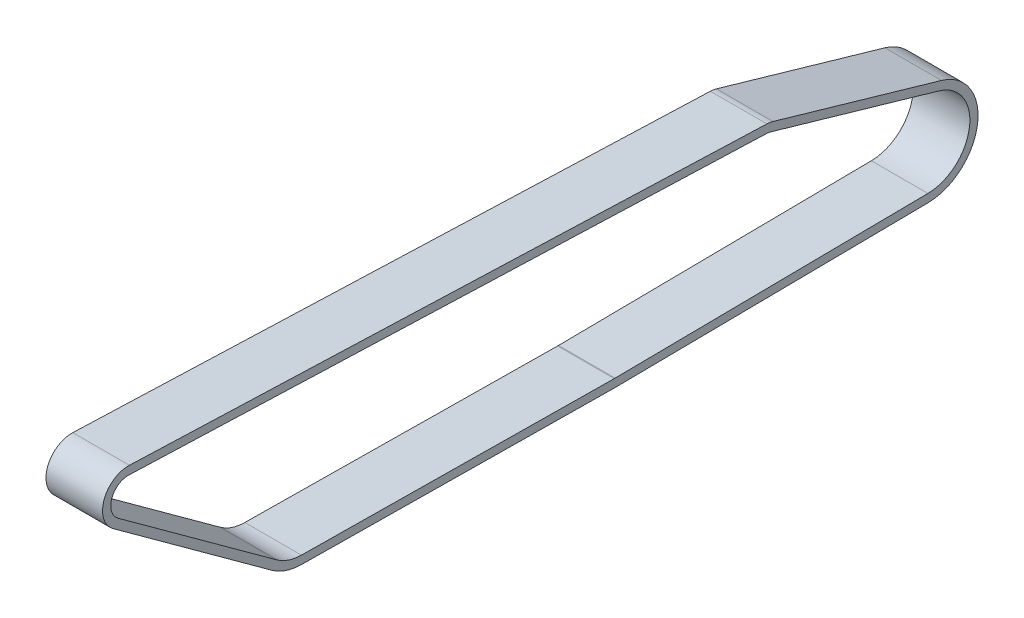
ISO-10303-21;
HEADER;
FILE_DESCRIPTION(('STEP AP214'),'2;1');
FILE_NAME('part.step','',(''),(''),'','','');
FILE_SCHEMA(('AUTOMOTIVE_DESIGN { 1 0 10303 214 1 1 1 1 }'));
ENDSEC;
DATA;
#1=APPLICATION_CONTEXT('core data for automotive mechanical design processes');
#2=APPLICATION_PROTOCOL_DEFINITION('international standard','automotive_design',2000,#1);
#3=PRODUCT_CONTEXT('',#1,'mechanical');
#4=PRODUCT('Part','Part','',(#3));
#5=PRODUCT_RELATED_PRODUCT_CATEGORY('part','',(#4));
#6=PRODUCT_DEFINITION_FORMATION('','',#4);
#7=PRODUCT_DEFINITION_CONTEXT('part definition',#1,'design');
#8=PRODUCT_DEFINITION('design','',#6,#7);
#9=PRODUCT_DEFINITION_SHAPE('','',#8);
#10=(LENGTH_UNIT() NAMED_UNIT(*) SI_UNIT(.MILLI.,.METRE.));
#11=(NAMED_UNIT(*) PLANE_ANGLE_UNIT() SI_UNIT($,.RADIAN.));
#12=(NAMED_UNIT(*) SI_UNIT($,.STERADIAN.) SOLID_ANGLE_UNIT());
#13=UNCERTAINTY_MEASURE_WITH_UNIT(LENGTH_MEASURE(1.E-05),#10,'distance_accuracy_value','');
#14=(GEOMETRIC_REPRESENTATION_CONTEXT(3) GLOBAL_UNCERTAINTY_ASSIGNED_CONTEXT((#13)) GLOBAL_UNIT_ASSIGNED_CONTEXT((#10,
#11,#12)) REPRESENTATION_CONTEXT('',''));
#15=CARTESIAN_POINT('',(0.,0.,0.));
#16=DIRECTION('',(0.,0.,1.));
#17=DIRECTION('',(1.,0.,0.));
#18=AXIS2_PLACEMENT_3D('',#15,#16,#17);
#19=CARTESIAN_POINT('',(50.8,139.781711065105,-19.05));
#20=DIRECTION('',(1.,0.,0.));
#21=DIRECTION('',(0.,0.,-1.));
#22=AXIS2_PLACEMENT_3D('',#19,#20,#21);
#23=PLANE('',#22);
#24=CARTESIAN_POINT('',(50.8,139.781711065105,-19.05));
#25=DIRECTION('',(1.,0.,0.));
#26=DIRECTION('',(0.,0.,-1.));
#27=AXIS2_PLACEMENT_3D('',#24,#25,#26);
#28=CIRCLE('',#27,23.241);
#29=CARTESIAN_POINT('',(50.8,163.007447640308,-19.8921647934332));
#30=VERTEX_POINT('',#29);
#31=CARTESIAN_POINT('',(50.8,120.986489490419,-5.37945769332964));
#32=VERTEX_POINT('',#31);
#33=EDGE_CURVE('E308',#30,#32,#28,.T.);
#34=ORIENTED_EDGE('',*,*,#33,.T.);
#35=DIRECTION('',(0.,-0.588208007687723,-0.80870967577496));
#36=VECTOR('',#35,1.);
#37=CARTESIAN_POINT('',(50.8,120.986489490419,-5.37945769332964));
#38=LINE('',#37,#36);
#39=CARTESIAN_POINT('',(50.8,17.2062058812158,-148.063879551777));
#40=VERTEX_POINT('',#39);
#41=EDGE_CURVE('E311',#32,#40,#38,.T.);
#42=ORIENTED_EDGE('',*,*,#41,.T.);
#43=CARTESIAN_POINT('',(50.8,53.9750000000001,-174.807344829307));
#44=DIRECTION('',(1.,0.,0.));
#45=DIRECTION('',(0.,0.,-1.));
#46=AXIS2_PLACEMENT_3D('',#43,#44,#45);
#47=CIRCLE('',#46,45.466);
#48=CARTESIAN_POINT('',(50.8,8.51190409271173,-174.293470793479));
#49=VERTEX_POINT('',#48);
#50=EDGE_CURVE('E314',#40,#49,#47,.T.);
#51=ORIENTED_EDGE('',*,*,#50,.T.);
#52=DIRECTION('',(0.,-0.0113023805883152,-0.999936126056578));
#53=VECTOR('',#52,1.);
#54=CARTESIAN_POINT('',(50.8,8.51190409271173,-174.293470793479));
#55=LINE('',#54,#53);
#56=CARTESIAN_POINT('',(50.8,5.33690409271174,-455.189798378825));
#57=VERTEX_POINT('',#56);
#58=EDGE_CURVE('E316',#49,#57,#55,.T.);
#59=ORIENTED_EDGE('',*,*,#58,.T.);
#60=CARTESIAN_POINT('',(50.8,50.8000000000001,-455.703672414654));
#61=DIRECTION('',(1.,0.,0.));
#62=DIRECTION('',(0.,0.,-1.));
#63=AXIS2_PLACEMENT_3D('',#60,#61,#62);
#64=CIRCLE('',#63,45.466);
#65=CARTESIAN_POINT('',(50.8,5.33690409271174,-456.217546450482));
#66=VERTEX_POINT('',#65);
#67=EDGE_CURVE('E318',#57,#66,#64,.T.);
#68=ORIENTED_EDGE('',*,*,#67,.T.);
#69=DIRECTION('',(0.,0.0113023805883152,-0.999936126056578));
#70=VECTOR('',#69,1.);
#71=CARTESIAN_POINT('',(50.8,5.33690409271174,-456.217546450482));
#72=LINE('',#71,#70);
#73=CARTESIAN_POINT('',(50.8,8.51190409271173,-737.113874035828));
#74=VERTEX_POINT('',#73);
#75=EDGE_CURVE('E320',#66,#74,#72,.T.);
#76=ORIENTED_EDGE('',*,*,#75,.T.);
#77=CARTESIAN_POINT('',(50.8,53.975,-736.6));
#78=DIRECTION('',(1.,0.,0.));
#79=DIRECTION('',(0.,0.,-1.));
#80=AXIS2_PLACEMENT_3D('',#77,#78,#79);
#81=CIRCLE('',#80,45.4659999999999);
#82=CARTESIAN_POINT('',(50.8,97.654109902954,-749.22111382112));
#83=VERTEX_POINT('',#82);
#84=EDGE_CURVE('E322',#74,#83,#81,.T.);
#85=ORIENTED_EDGE('',*,*,#84,.T.);
#86=DIRECTION('',(0.,0.277594550237976,0.960698321887874));
#87=VECTOR('',#86,1.);
#88=CARTESIAN_POINT('',(50.8,141.372359959145,-597.921135385479));
#89=LINE('',#88,#87);
#90=CARTESIAN_POINT('',(50.8,141.372359959145,-597.921135385479));
#91=VERTEX_POINT('',#90);
#92=EDGE_CURVE('E324',#83,#91,#89,.T.);
#93=ORIENTED_EDGE('',*,*,#92,.T.);
#94=CARTESIAN_POINT('',(50.8,119.654813694548,-591.645832982799));
#95=DIRECTION('',(1.,0.,0.));
#96=DIRECTION('',(0.,0.,-1.));
#97=AXIS2_PLACEMENT_3D('',#94,#95,#96);
#98=CIRCLE('',#97,22.606);
#99=CARTESIAN_POINT('',(50.8,142.245967303215,-592.464987809199));
#100=VERTEX_POINT('',#99);
#101=EDGE_CURVE('E326',#91,#100,#98,.T.);
#102=ORIENTED_EDGE('',*,*,#101,.T.);
#103=DIRECTION('',(0.,0.0362361685570006,0.999343254386754));
#104=VECTOR('',#103,1.);
#105=CARTESIAN_POINT('',(50.8,163.007447640308,-19.8921647934332));
#106=LINE('',#105,#104);
#107=EDGE_CURVE('E328',#100,#30,#106,.T.);
#108=ORIENTED_EDGE('',*,*,#107,.T.);
#109=EDGE_LOOP('',(#34,#42,#51,#59,#68,#76,#85,#93,#102,#108));
#110=FACE_BOUND('',#109,.T.);
#111=DIRECTION('',(0.,-0.588208007687723,-0.80870967577496));
#112=VECTOR('',#111,1.);
#113=CARTESIAN_POINT('',(50.8,126.943444962177,-9.71219787795741));
#114=LINE('',#113,#112);
#115=CARTESIAN_POINT('',(50.8,126.943444962177,-9.71219787795741));
#116=VERTEX_POINT('',#115);
#117=CARTESIAN_POINT('',(50.8,23.1631613529742,-152.396619736405));
#118=VERTEX_POINT('',#117);
#119=EDGE_CURVE('E237',#116,#118,#114,.T.);
#120=ORIENTED_EDGE('',*,*,#119,.F.);
#121=CARTESIAN_POINT('',(50.8,139.781711065105,-19.05));
#122=DIRECTION('',(1.,0.,0.));
#123=DIRECTION('',(0.,0.,-1.));
#124=AXIS2_PLACEMENT_3D('',#121,#122,#123);
#125=CIRCLE('',#124,15.875);
#126=CARTESIAN_POINT('',(50.8,155.646285228495,-19.6252491758424));
#127=VERTEX_POINT('',#126);
#128=EDGE_CURVE('E229',#127,#116,#125,.T.);
#129=ORIENTED_EDGE('',*,*,#128,.F.);
#130=DIRECTION('',(0.,0.0362361685570006,0.999343254386754));
#131=VECTOR('',#130,1.);
#132=CARTESIAN_POINT('',(50.8,155.646285228495,-19.6252491758424));
#133=LINE('',#132,#131);
#134=CARTESIAN_POINT('',(50.8,134.884804891402,-592.198072191608));
#135=VERTEX_POINT('',#134);
#136=EDGE_CURVE('E266',#135,#127,#133,.T.);
#137=ORIENTED_EDGE('',*,*,#136,.F.);
#138=CARTESIAN_POINT('',(50.8,119.654813694548,-591.645832982799));
#139=DIRECTION('',(1.,0.,0.));
#140=DIRECTION('',(0.,0.,-1.));
#141=AXIS2_PLACEMENT_3D('',#138,#139,#140);
#142=CIRCLE('',#141,15.24);
#143=CARTESIAN_POINT('',(50.8,134.295856120119,-595.876373928426));
#144=VERTEX_POINT('',#143);
#145=EDGE_CURVE('E264',#144,#135,#142,.T.);
#146=ORIENTED_EDGE('',*,*,#145,.F.);
#147=DIRECTION('',(0.,0.277594550237976,0.960698321887874));
#148=VECTOR('',#147,1.);
#149=CARTESIAN_POINT('',(50.8,134.295856120119,-595.876373928426));
#150=LINE('',#149,#148);
#151=CARTESIAN_POINT('',(50.8,90.577606063928,-747.176352364067));
#152=VERTEX_POINT('',#151);
#153=EDGE_CURVE('E262',#152,#144,#150,.T.);
#154=ORIENTED_EDGE('',*,*,#153,.F.);
#155=CARTESIAN_POINT('',(50.8,53.975,-736.6));
#156=DIRECTION('',(1.,0.,0.));
#157=DIRECTION('',(0.,0.,-1.));
#158=AXIS2_PLACEMENT_3D('',#155,#156,#157);
#159=CIRCLE('',#158,38.0999999999999);
#160=CARTESIAN_POINT('',(50.8,15.8774335972444,-737.030620700415));
#161=VERTEX_POINT('',#160);
#162=EDGE_CURVE('E260',#161,#152,#159,.T.);
#163=ORIENTED_EDGE('',*,*,#162,.F.);
#164=DIRECTION('',(0.,0.0113023805883152,-0.999936126056578));
#165=VECTOR('',#164,1.);
#166=CARTESIAN_POINT('',(50.8,12.7024335972445,-456.134293115069));
#167=LINE('',#166,#165);
#168=CARTESIAN_POINT('',(50.8,12.7024335972445,-456.134293115069));
#169=VERTEX_POINT('',#168);
#170=EDGE_CURVE('E258',#169,#161,#167,.T.);
#171=ORIENTED_EDGE('',*,*,#170,.F.);
#172=CARTESIAN_POINT('',(50.8,50.8000000000001,-455.703672414654));
#173=DIRECTION('',(1.,0.,0.));
#174=DIRECTION('',(0.,0.,-1.));
#175=AXIS2_PLACEMENT_3D('',#172,#173,#174);
#176=CIRCLE('',#175,38.1);
#177=CARTESIAN_POINT('',(50.8,12.7024335972445,-455.273051714239));
#178=VERTEX_POINT('',#177);
#179=EDGE_CURVE('E256',#178,#169,#176,.T.);
#180=ORIENTED_EDGE('',*,*,#179,.F.);
#181=DIRECTION('',(0.,-0.0113023805883152,-0.999936126056578));
#182=VECTOR('',#181,1.);
#183=CARTESIAN_POINT('',(50.8,15.8774335972445,-174.376724128893));
#184=LINE('',#183,#182);
#185=CARTESIAN_POINT('',(50.8,15.8774335972445,-174.376724128893));
#186=VERTEX_POINT('',#185);
#187=EDGE_CURVE('E252',#186,#178,#184,.T.);
#188=ORIENTED_EDGE('',*,*,#187,.F.);
#189=CARTESIAN_POINT('',(50.8,53.9750000000001,-174.807344829307));
#190=DIRECTION('',(1.,0.,0.));
#191=DIRECTION('',(0.,0.,-1.));
#192=AXIS2_PLACEMENT_3D('',#189,#190,#191);
#193=CIRCLE('',#192,38.1);
#194=EDGE_CURVE('E250',#118,#186,#193,.T.);
#195=ORIENTED_EDGE('',*,*,#194,.F.);
#196=EDGE_LOOP('',(#120,#129,#137,#146,#154,#163,#171,#180,#188,#195));
#197=FACE_BOUND('',#196,.T.);
#198=ADVANCED_FACE('F92',(#110,#197),#23,.T.);
#199=CARTESIAN_POINT('',(0.,139.781711065105,-19.05));
#200=DIRECTION('',(1.,0.,0.));
#201=DIRECTION('',(0.,0.,-1.));
#202=AXIS2_PLACEMENT_3D('',#199,#200,#201);
#203=PLANE('',#202);
#204=CARTESIAN_POINT('',(0.,139.781711065105,-19.05));
#205=DIRECTION('',(1.,0.,0.));
#206=DIRECTION('',(0.,0.,-1.));
#207=AXIS2_PLACEMENT_3D('',#204,#205,#206);
#208=CIRCLE('',#207,23.241);
#209=CARTESIAN_POINT('',(0.,163.007447640308,-19.8921647934332));
#210=VERTEX_POINT('',#209);
#211=CARTESIAN_POINT('',(0.,120.986489490419,-5.37945769332964));
#212=VERTEX_POINT('',#211);
#213=EDGE_CURVE('E245',#210,#212,#208,.T.);
#214=ORIENTED_EDGE('',*,*,#213,.F.);
#215=DIRECTION('',(0.,0.0362361685570006,0.999343254386754));
#216=VECTOR('',#215,1.);
#217=CARTESIAN_POINT('',(0.,163.007447640308,-19.8921647934332));
#218=LINE('',#217,#216);
#219=CARTESIAN_POINT('',(0.,142.245967303215,-592.464987809199));
#220=VERTEX_POINT('',#219);
#221=EDGE_CURVE('E312',#220,#210,#218,.T.);
#222=ORIENTED_EDGE('',*,*,#221,.F.);
#223=CARTESIAN_POINT('',(0.,119.654813694548,-591.645832982799));
#224=DIRECTION('',(1.,0.,0.));
#225=DIRECTION('',(0.,0.,-1.));
#226=AXIS2_PLACEMENT_3D('',#223,#224,#225);
#227=CIRCLE('',#226,22.606);
#228=CARTESIAN_POINT('',(0.,141.372359959145,-597.921135385479));
#229=VERTEX_POINT('',#228);
#230=EDGE_CURVE('E347',#229,#220,#227,.T.);
#231=ORIENTED_EDGE('',*,*,#230,.F.);
#232=DIRECTION('',(0.,0.277594550237976,0.960698321887874));
#233=VECTOR('',#232,1.);
#234=CARTESIAN_POINT('',(0.,141.372359959145,-597.921135385479));
#235=LINE('',#234,#233);
#236=CARTESIAN_POINT('',(0.,97.654109902954,-749.22111382112));
#237=VERTEX_POINT('',#236);
#238=EDGE_CURVE('E345',#237,#229,#235,.T.);
#239=ORIENTED_EDGE('',*,*,#238,.F.);
#240=CARTESIAN_POINT('',(0.,53.975,-736.6));
#241=DIRECTION('',(1.,0.,0.));
#242=DIRECTION('',(0.,0.,-1.));
#243=AXIS2_PLACEMENT_3D('',#240,#241,#242);
#244=CIRCLE('',#243,45.4659999999999);
#245=CARTESIAN_POINT('',(0.,8.51190409271173,-737.113874035828));
#246=VERTEX_POINT('',#245);
#247=EDGE_CURVE('E343',#246,#237,#244,.T.);
#248=ORIENTED_EDGE('',*,*,#247,.F.);
#249=DIRECTION('',(0.,0.0113023805883152,-0.999936126056578));
#250=VECTOR('',#249,1.);
#251=CARTESIAN_POINT('',(0.,5.33690409271174,-456.217546450482));
#252=LINE('',#251,#250);
#253=CARTESIAN_POINT('',(0.,5.33690409271174,-456.217546450482));
#254=VERTEX_POINT('',#253);
#255=EDGE_CURVE('E341',#254,#246,#252,.T.);
#256=ORIENTED_EDGE('',*,*,#255,.F.);
#257=CARTESIAN_POINT('',(0.,50.8000000000001,-455.703672414654));
#258=DIRECTION('',(1.,0.,0.));
#259=DIRECTION('',(0.,0.,-1.));
#260=AXIS2_PLACEMENT_3D('',#257,#258,#259);
#261=CIRCLE('',#260,45.466);
#262=CARTESIAN_POINT('',(0.,5.33690409271174,-455.189798378825));
#263=VERTEX_POINT('',#262);
#264=EDGE_CURVE('E339',#263,#254,#261,.T.);
#265=ORIENTED_EDGE('',*,*,#264,.F.);
#266=DIRECTION('',(0.,-0.0113023805883152,-0.999936126056578));
#267=VECTOR('',#266,1.);
#268=CARTESIAN_POINT('',(0.,8.51190409271173,-174.293470793479));
#269=LINE('',#268,#267);
#270=CARTESIAN_POINT('',(0.,8.51190409271173,-174.293470793479));
#271=VERTEX_POINT('',#270);
#272=EDGE_CURVE('E337',#271,#263,#269,.T.);
#273=ORIENTED_EDGE('',*,*,#272,.F.);
#274=CARTESIAN_POINT('',(0.,53.9750000000001,-174.807344829307));
#275=DIRECTION('',(1.,0.,0.));
#276=DIRECTION('',(0.,0.,-1.));
#277=AXIS2_PLACEMENT_3D('',#274,#275,#276);
#278=CIRCLE('',#277,45.466);
#279=CARTESIAN_POINT('',(0.,17.2062058812158,-148.063879551777));
#280=VERTEX_POINT('',#279);
#281=EDGE_CURVE('E335',#280,#271,#278,.T.);
#282=ORIENTED_EDGE('',*,*,#281,.F.);
#283=DIRECTION('',(0.,-0.588208007687723,-0.80870967577496));
#284=VECTOR('',#283,1.);
#285=CARTESIAN_POINT('',(0.,120.986489490419,-5.37945769332964));
#286=LINE('',#285,#284);
#287=EDGE_CURVE('E333',#212,#280,#286,.T.);
#288=ORIENTED_EDGE('',*,*,#287,.F.);
#289=EDGE_LOOP('',(#214,#222,#231,#239,#248,#256,#265,#273,#282,#288));
#290=FACE_BOUND('',#289,.T.);
#291=CARTESIAN_POINT('',(0.,139.781711065105,-19.05));
#292=DIRECTION('',(1.,0.,0.));
#293=DIRECTION('',(0.,0.,-1.));
#294=AXIS2_PLACEMENT_3D('',#291,#292,#293);
#295=CIRCLE('',#294,15.875);
#296=CARTESIAN_POINT('',(0.,155.646285228495,-19.6252491758424));
#297=VERTEX_POINT('',#296);
#298=CARTESIAN_POINT('',(0.,126.943444962177,-9.71219787795741));
#299=VERTEX_POINT('',#298);
#300=EDGE_CURVE('E115',#297,#299,#295,.T.);
#301=ORIENTED_EDGE('',*,*,#300,.T.);
#302=DIRECTION('',(0.,-0.588208007687723,-0.80870967577496));
#303=VECTOR('',#302,1.);
#304=CARTESIAN_POINT('',(0.,126.943444962177,-9.71219787795741));
#305=LINE('',#304,#303);
#306=CARTESIAN_POINT('',(0.,23.1631613529742,-152.396619736405));
#307=VERTEX_POINT('',#306);
#308=EDGE_CURVE('E244',#299,#307,#305,.T.);
#309=ORIENTED_EDGE('',*,*,#308,.T.);
#310=CARTESIAN_POINT('',(0.,53.9750000000001,-174.807344829307));
#311=DIRECTION('',(1.,0.,0.));
#312=DIRECTION('',(0.,0.,-1.));
#313=AXIS2_PLACEMENT_3D('',#310,#311,#312);
#314=CIRCLE('',#313,38.1);
#315=CARTESIAN_POINT('',(0.,15.8774335972445,-174.376724128893));
#316=VERTEX_POINT('',#315);
#317=EDGE_CURVE('E270',#307,#316,#314,.T.);
#318=ORIENTED_EDGE('',*,*,#317,.T.);
#319=DIRECTION('',(0.,-0.0113023805883152,-0.999936126056578));
#320=VECTOR('',#319,1.);
#321=CARTESIAN_POINT('',(0.,15.8774335972445,-174.376724128893));
#322=LINE('',#321,#320);
#323=CARTESIAN_POINT('',(0.,12.7024335972445,-455.273051714239));
#324=VERTEX_POINT('',#323);
#325=EDGE_CURVE('E273',#316,#324,#322,.T.);
#326=ORIENTED_EDGE('',*,*,#325,.T.);
#327=CARTESIAN_POINT('',(0.,50.8000000000001,-455.703672414654));
#328=DIRECTION('',(1.,0.,0.));
#329=DIRECTION('',(0.,0.,-1.));
#330=AXIS2_PLACEMENT_3D('',#327,#328,#329);
#331=CIRCLE('',#330,38.1);
#332=CARTESIAN_POINT('',(0.,12.7024335972445,-456.134293115069));
#333=VERTEX_POINT('',#332);
#334=EDGE_CURVE('E276',#324,#333,#331,.T.);
#335=ORIENTED_EDGE('',*,*,#334,.T.);
#336=DIRECTION('',(0.,0.0113023805883152,-0.999936126056578));
#337=VECTOR('',#336,1.);
#338=CARTESIAN_POINT('',(0.,12.7024335972445,-456.134293115069));
#339=LINE('',#338,#337);
#340=CARTESIAN_POINT('',(0.,15.8774335972444,-737.030620700415));
#341=VERTEX_POINT('',#340);
#342=EDGE_CURVE('E279',#333,#341,#339,.T.);
#343=ORIENTED_EDGE('',*,*,#342,.T.);
#344=CARTESIAN_POINT('',(0.,53.975,-736.6));
#345=DIRECTION('',(1.,0.,0.));
#346=DIRECTION('',(0.,0.,-1.));
#347=AXIS2_PLACEMENT_3D('',#344,#345,#346);
#348=CIRCLE('',#347,38.0999999999999);
#349=CARTESIAN_POINT('',(0.,90.577606063928,-747.176352364067));
#350=VERTEX_POINT('',#349);
#351=EDGE_CURVE('E282',#341,#350,#348,.T.);
#352=ORIENTED_EDGE('',*,*,#351,.T.);
#353=DIRECTION('',(0.,0.277594550237976,0.960698321887874));
#354=VECTOR('',#353,1.);
#355=CARTESIAN_POINT('',(0.,134.295856120119,-595.876373928426));
#356=LINE('',#355,#354);
#357=CARTESIAN_POINT('',(0.,134.295856120119,-595.876373928426));
#358=VERTEX_POINT('',#357);
#359=EDGE_CURVE('E285',#350,#358,#356,.T.);
#360=ORIENTED_EDGE('',*,*,#359,.T.);
#361=CARTESIAN_POINT('',(0.,119.654813694548,-591.645832982799));
#362=DIRECTION('',(1.,0.,0.));
#363=DIRECTION('',(0.,0.,-1.));
#364=AXIS2_PLACEMENT_3D('',#361,#362,#363);
#365=CIRCLE('',#364,15.24);
#366=CARTESIAN_POINT('',(0.,134.884804891402,-592.198072191608));
#367=VERTEX_POINT('',#366);
#368=EDGE_CURVE('E288',#358,#367,#365,.T.);
#369=ORIENTED_EDGE('',*,*,#368,.T.);
#370=DIRECTION('',(0.,0.0362361685570006,0.999343254386754));
#371=VECTOR('',#370,1.);
#372=CARTESIAN_POINT('',(0.,155.646285228495,-19.6252491758424));
#373=LINE('',#372,#371);
#374=EDGE_CURVE('E238',#367,#297,#373,.T.);
#375=ORIENTED_EDGE('',*,*,#374,.T.);
#376=EDGE_LOOP('',(#301,#309,#318,#326,#335,#343,#352,#360,#369,#375));
#377=FACE_BOUND('',#376,.T.);
#378=ADVANCED_FACE('F383',(#290,#377),#203,.F.);
#379=CARTESIAN_POINT('',(50.8,139.781711065105,-19.05));
#380=DIRECTION('',(-1.,0.,0.));
#381=DIRECTION('',(0.,0.,1.));
#382=AXIS2_PLACEMENT_3D('',#379,#380,#381);
#383=CYLINDRICAL_SURFACE('',#382,23.241);
#384=ORIENTED_EDGE('',*,*,#213,.T.);
#385=DIRECTION('',(-1.,0.,0.));
#386=VECTOR('',#385,1.);
#387=CARTESIAN_POINT('',(50.8,120.986489490419,-5.37945769332964));
#388=LINE('',#387,#386);
#389=EDGE_CURVE('E12',#32,#212,#388,.T.);
#390=ORIENTED_EDGE('',*,*,#389,.F.);
#391=ORIENTED_EDGE('',*,*,#33,.F.);
#392=DIRECTION('',(-1.,0.,0.));
#393=VECTOR('',#392,1.);
#394=CARTESIAN_POINT('',(50.8,163.007447640308,-19.8921647934332));
#395=LINE('',#394,#393);
#396=EDGE_CURVE('E330',#30,#210,#395,.T.);
#397=ORIENTED_EDGE('',*,*,#396,.T.);
#398=EDGE_LOOP('',(#384,#390,#391,#397));
#399=FACE_BOUND('',#398,.T.);
#400=ADVANCED_FACE('F94',(#399),#383,.T.);
#401=CARTESIAN_POINT('',(50.8,120.986489490419,-5.37945769332964));
#402=DIRECTION('',(0.,0.80870967577496,-0.588208007687723));
#403=DIRECTION('',(0.,0.588208007687723,0.80870967577496));
#404=AXIS2_PLACEMENT_3D('',#401,#402,#403);
#405=PLANE('',#404);
#406=ORIENTED_EDGE('',*,*,#287,.T.);
#407=DIRECTION('',(-1.,0.,0.));
#408=VECTOR('',#407,1.);
#409=CARTESIAN_POINT('',(50.8,17.2062058812158,-148.063879551777));
#410=LINE('',#409,#408);
#411=EDGE_CURVE('E100',#40,#280,#410,.T.);
#412=ORIENTED_EDGE('',*,*,#411,.F.);
#413=ORIENTED_EDGE('',*,*,#41,.F.);
#414=ORIENTED_EDGE('',*,*,#389,.T.);
#415=EDGE_LOOP('',(#406,#412,#413,#414));
#416=FACE_BOUND('',#415,.T.);
#417=ADVANCED_FACE('F400',(#416),#405,.F.);
#418=CARTESIAN_POINT('',(50.8,53.9750000000001,-174.807344829307));
#419=DIRECTION('',(-1.,0.,0.));
#420=DIRECTION('',(0.,0.,1.));
#421=AXIS2_PLACEMENT_3D('',#418,#419,#420);
#422=CYLINDRICAL_SURFACE('',#421,45.466);
#423=ORIENTED_EDGE('',*,*,#281,.T.);
#424=DIRECTION('',(-1.,0.,0.));
#425=VECTOR('',#424,1.);
#426=CARTESIAN_POINT('',(50.8,8.51190409271173,-174.293470793479));
#427=LINE('',#426,#425);
#428=EDGE_CURVE('E370',#49,#271,#427,.T.);
#429=ORIENTED_EDGE('',*,*,#428,.F.);
#430=ORIENTED_EDGE('',*,*,#50,.F.);
#431=ORIENTED_EDGE('',*,*,#411,.T.);
#432=EDGE_LOOP('',(#423,#429,#430,#431));
#433=FACE_BOUND('',#432,.T.);
#434=ADVANCED_FACE('F377',(#433),#422,.T.);
#435=CARTESIAN_POINT('',(50.8,8.51190409271173,-174.293470793479));
#436=DIRECTION('',(0.,0.999936126056578,-0.0113023805883152));
#437=DIRECTION('',(0.,0.0113023805883152,0.999936126056578));
#438=AXIS2_PLACEMENT_3D('',#435,#436,#437);
#439=PLANE('',#438);
#440=ORIENTED_EDGE('',*,*,#272,.T.);
#441=DIRECTION('',(-1.,0.,0.));
#442=VECTOR('',#441,1.);
#443=CARTESIAN_POINT('',(50.8,5.33690409271174,-455.189798378825));
#444=LINE('',#443,#442);
#445=EDGE_CURVE('E367',#57,#263,#444,.T.);
#446=ORIENTED_EDGE('',*,*,#445,.F.);
#447=ORIENTED_EDGE('',*,*,#58,.F.);
#448=ORIENTED_EDGE('',*,*,#428,.T.);
#449=EDGE_LOOP('',(#440,#446,#447,#448));
#450=FACE_BOUND('',#449,.T.);
#451=ADVANCED_FACE('F389',(#450),#439,.F.);
#452=CARTESIAN_POINT('',(50.8,50.8000000000001,-455.703672414654));
#453=DIRECTION('',(-1.,0.,0.));
#454=DIRECTION('',(0.,0.,1.));
#455=AXIS2_PLACEMENT_3D('',#452,#453,#454);
#456=CYLINDRICAL_SURFACE('',#455,45.466);
#457=ORIENTED_EDGE('',*,*,#264,.T.);
#458=DIRECTION('',(-1.,0.,0.));
#459=VECTOR('',#458,1.);
#460=CARTESIAN_POINT('',(50.8,5.33690409271174,-456.217546450482));
#461=LINE('',#460,#459);
#462=EDGE_CURVE('E364',#66,#254,#461,.T.);
#463=ORIENTED_EDGE('',*,*,#462,.F.);
#464=ORIENTED_EDGE('',*,*,#67,.F.);
#465=ORIENTED_EDGE('',*,*,#445,.T.);
#466=EDGE_LOOP('',(#457,#463,#464,#465));
#467=FACE_BOUND('',#466,.T.);
#468=ADVANCED_FACE('F393',(#467),#456,.T.);
#469=CARTESIAN_POINT('',(50.8,5.33690409271174,-456.217546450482));
#470=DIRECTION('',(0.,0.999936126056578,0.0113023805883152));
#471=DIRECTION('',(0.,-0.0113023805883152,0.999936126056578));
#472=AXIS2_PLACEMENT_3D('',#469,#470,#471);
#473=PLANE('',#472);
#474=ORIENTED_EDGE('',*,*,#255,.T.);
#475=DIRECTION('',(-1.,0.,0.));
#476=VECTOR('',#475,1.);
#477=CARTESIAN_POINT('',(50.8,8.51190409271173,-737.113874035828));
#478=LINE('',#477,#476);
#479=EDGE_CURVE('E361',#74,#246,#478,.T.);
#480=ORIENTED_EDGE('',*,*,#479,.F.);
#481=ORIENTED_EDGE('',*,*,#75,.F.);
#482=ORIENTED_EDGE('',*,*,#462,.T.);
#483=EDGE_LOOP('',(#474,#480,#481,#482));
#484=FACE_BOUND('',#483,.T.);
#485=ADVANCED_FACE('F423',(#484),#473,.F.);
#486=CARTESIAN_POINT('',(50.8,53.975,-736.6));
#487=DIRECTION('',(-1.,0.,0.));
#488=DIRECTION('',(0.,0.,1.));
#489=AXIS2_PLACEMENT_3D('',#486,#487,#488);
#490=CYLINDRICAL_SURFACE('',#489,45.4659999999999);
#491=ORIENTED_EDGE('',*,*,#247,.T.);
#492=DIRECTION('',(-1.,0.,0.));
#493=VECTOR('',#492,1.);
#494=CARTESIAN_POINT('',(50.8,97.654109902954,-749.22111382112));
#495=LINE('',#494,#493);
#496=EDGE_CURVE('E358',#83,#237,#495,.T.);
#497=ORIENTED_EDGE('',*,*,#496,.F.);
#498=ORIENTED_EDGE('',*,*,#84,.F.);
#499=ORIENTED_EDGE('',*,*,#479,.T.);
#500=EDGE_LOOP('',(#491,#497,#498,#499));
#501=FACE_BOUND('',#500,.T.);
#502=ADVANCED_FACE('F420',(#501),#490,.T.);
#503=CARTESIAN_POINT('',(50.8,141.372359959145,-597.921135385479));
#504=DIRECTION('',(0.,-0.960698321887873,0.277594550237975));
#505=DIRECTION('',(0.,-0.277594550237976,-0.960698321887874));
#506=AXIS2_PLACEMENT_3D('',#503,#504,#505);
#507=PLANE('',#506);
#508=ORIENTED_EDGE('',*,*,#238,.T.);
#509=DIRECTION('',(-1.,0.,0.));
#510=VECTOR('',#509,1.);
#511=CARTESIAN_POINT('',(50.8,141.372359959145,-597.921135385479));
#512=LINE('',#511,#510);
#513=EDGE_CURVE('E355',#91,#229,#512,.T.);
#514=ORIENTED_EDGE('',*,*,#513,.F.);
#515=ORIENTED_EDGE('',*,*,#92,.F.);
#516=ORIENTED_EDGE('',*,*,#496,.T.);
#517=EDGE_LOOP('',(#508,#514,#515,#516));
#518=FACE_BOUND('',#517,.T.);
#519=ADVANCED_FACE('F416',(#518),#507,.F.);
#520=CARTESIAN_POINT('',(50.8,119.654813694548,-591.645832982799));
#521=DIRECTION('',(-1.,0.,0.));
#522=DIRECTION('',(0.,0.,1.));
#523=AXIS2_PLACEMENT_3D('',#520,#521,#522);
#524=CYLINDRICAL_SURFACE('',#523,22.606);
#525=ORIENTED_EDGE('',*,*,#230,.T.);
#526=DIRECTION('',(-1.,0.,0.));
#527=VECTOR('',#526,1.);
#528=CARTESIAN_POINT('',(50.8,142.245967303215,-592.464987809199));
#529=LINE('',#528,#527);
#530=EDGE_CURVE('E352',#100,#220,#529,.T.);
#531=ORIENTED_EDGE('',*,*,#530,.F.);
#532=ORIENTED_EDGE('',*,*,#101,.F.);
#533=ORIENTED_EDGE('',*,*,#513,.T.);
#534=EDGE_LOOP('',(#525,#531,#532,#533));
#535=FACE_BOUND('',#534,.T.);
#536=ADVANCED_FACE('F412',(#535),#524,.T.);
#537=CARTESIAN_POINT('',(50.8,163.007447640308,-19.8921647934332));
#538=DIRECTION('',(0.,-0.999343254386754,0.0362361685570006));
#539=DIRECTION('',(0.,-0.0362361685570006,-0.999343254386754));
#540=AXIS2_PLACEMENT_3D('',#537,#538,#539);
#541=PLANE('',#540);
#542=ORIENTED_EDGE('',*,*,#221,.T.);
#543=ORIENTED_EDGE('',*,*,#396,.F.);
#544=ORIENTED_EDGE('',*,*,#107,.F.);
#545=ORIENTED_EDGE('',*,*,#530,.T.);
#546=EDGE_LOOP('',(#542,#543,#544,#545));
#547=FACE_BOUND('',#546,.T.);
#548=ADVANCED_FACE('F407',(#547),#541,.F.);
#549=CARTESIAN_POINT('',(50.8,139.781711065105,-19.05));
#550=DIRECTION('',(-1.,0.,0.));
#551=DIRECTION('',(0.,0.,1.));
#552=AXIS2_PLACEMENT_3D('',#549,#550,#551);
#553=CYLINDRICAL_SURFACE('',#552,15.875);
#554=ORIENTED_EDGE('',*,*,#300,.F.);
#555=DIRECTION('',(-1.,0.,0.));
#556=VECTOR('',#555,1.);
#557=CARTESIAN_POINT('',(50.8,155.646285228495,-19.6252491758424));
#558=LINE('',#557,#556);
#559=EDGE_CURVE('E233',#127,#297,#558,.T.);
#560=ORIENTED_EDGE('',*,*,#559,.F.);
#561=ORIENTED_EDGE('',*,*,#128,.T.);
#562=DIRECTION('',(-1.,0.,0.));
#563=VECTOR('',#562,1.);
#564=CARTESIAN_POINT('',(50.8,126.943444962177,-9.71219787795741));
#565=LINE('',#564,#563);
#566=EDGE_CURVE('E232',#116,#299,#565,.T.);
#567=ORIENTED_EDGE('',*,*,#566,.T.);
#568=EDGE_LOOP('',(#554,#560,#561,#567));
#569=FACE_BOUND('',#568,.T.);
#570=ADVANCED_FACE('F231',(#569),#553,.F.);
#571=CARTESIAN_POINT('',(50.8,126.943444962177,-9.71219787795741));
#572=DIRECTION('',(0.,0.80870967577496,-0.588208007687723));
#573=DIRECTION('',(0.,0.588208007687723,0.80870967577496));
#574=AXIS2_PLACEMENT_3D('',#571,#572,#573);
#575=PLANE('',#574);
#576=ORIENTED_EDGE('',*,*,#308,.F.);
#577=ORIENTED_EDGE('',*,*,#566,.F.);
#578=ORIENTED_EDGE('',*,*,#119,.T.);
#579=DIRECTION('',(-1.,0.,0.));
#580=VECTOR('',#579,1.);
#581=CARTESIAN_POINT('',(50.8,23.1631613529742,-152.396619736405));
#582=LINE('',#581,#580);
#583=EDGE_CURVE('E246',#118,#307,#582,.T.);
#584=ORIENTED_EDGE('',*,*,#583,.T.);
#585=EDGE_LOOP('',(#576,#577,#578,#584));
#586=FACE_BOUND('',#585,.T.);
#587=ADVANCED_FACE('F241',(#586),#575,.T.);
#588=CARTESIAN_POINT('',(50.8,53.9750000000001,-174.807344829307));
#589=DIRECTION('',(-1.,0.,0.));
#590=DIRECTION('',(0.,0.,1.));
#591=AXIS2_PLACEMENT_3D('',#588,#589,#590);
#592=CYLINDRICAL_SURFACE('',#591,38.1);
#593=ORIENTED_EDGE('',*,*,#317,.F.);
#594=ORIENTED_EDGE('',*,*,#583,.F.);
#595=ORIENTED_EDGE('',*,*,#194,.T.);
#596=DIRECTION('',(-1.,0.,0.));
#597=VECTOR('',#596,1.);
#598=CARTESIAN_POINT('',(50.8,15.8774335972445,-174.376724128893));
#599=LINE('',#598,#597);
#600=EDGE_CURVE('E305',#186,#316,#599,.T.);
#601=ORIENTED_EDGE('',*,*,#600,.T.);
#602=EDGE_LOOP('',(#593,#594,#595,#601));
#603=FACE_BOUND('',#602,.T.);
#604=ADVANCED_FACE('F469',(#603),#592,.F.);
#605=CARTESIAN_POINT('',(50.8,15.8774335972445,-174.376724128893));
#606=DIRECTION('',(0.,0.999936126056578,-0.0113023805883152));
#607=DIRECTION('',(0.,0.0113023805883152,0.999936126056578));
#608=AXIS2_PLACEMENT_3D('',#605,#606,#607);
#609=PLANE('',#608);
#610=ORIENTED_EDGE('',*,*,#325,.F.);
#611=ORIENTED_EDGE('',*,*,#600,.F.);
#612=ORIENTED_EDGE('',*,*,#187,.T.);
#613=DIRECTION('',(-1.,0.,0.));
#614=VECTOR('',#613,1.);
#615=CARTESIAN_POINT('',(50.8,12.7024335972445,-455.273051714239));
#616=LINE('',#615,#614);
#617=EDGE_CURVE('E303',#178,#324,#616,.T.);
#618=ORIENTED_EDGE('',*,*,#617,.T.);
#619=EDGE_LOOP('',(#610,#611,#612,#618));
#620=FACE_BOUND('',#619,.T.);
#621=ADVANCED_FACE('F475',(#620),#609,.T.);
#622=CARTESIAN_POINT('',(50.8,50.8000000000001,-455.703672414654));
#623=DIRECTION('',(-1.,0.,0.));
#624=DIRECTION('',(0.,0.,1.));
#625=AXIS2_PLACEMENT_3D('',#622,#623,#624);
#626=CYLINDRICAL_SURFACE('',#625,38.1);
#627=ORIENTED_EDGE('',*,*,#334,.F.);
#628=ORIENTED_EDGE('',*,*,#617,.F.);
#629=ORIENTED_EDGE('',*,*,#179,.T.);
#630=DIRECTION('',(-1.,0.,0.));
#631=VECTOR('',#630,1.);
#632=CARTESIAN_POINT('',(50.8,12.7024335972445,-456.134293115069));
#633=LINE('',#632,#631);
#634=EDGE_CURVE('E301',#169,#333,#633,.T.);
#635=ORIENTED_EDGE('',*,*,#634,.T.);
#636=EDGE_LOOP('',(#627,#628,#629,#635));
#637=FACE_BOUND('',#636,.T.);
#638=ADVANCED_FACE('F483',(#637),#626,.F.);
#639=CARTESIAN_POINT('',(50.8,12.7024335972445,-456.134293115069));
#640=DIRECTION('',(0.,0.999936126056578,0.0113023805883152));
#641=DIRECTION('',(0.,-0.0113023805883152,0.999936126056578));
#642=AXIS2_PLACEMENT_3D('',#639,#640,#641);
#643=PLANE('',#642);
#644=ORIENTED_EDGE('',*,*,#342,.F.);
#645=ORIENTED_EDGE('',*,*,#634,.F.);
#646=ORIENTED_EDGE('',*,*,#170,.T.);
#647=DIRECTION('',(-1.,0.,0.));
#648=VECTOR('',#647,1.);
#649=CARTESIAN_POINT('',(50.8,15.8774335972444,-737.030620700415));
#650=LINE('',#649,#648);
#651=EDGE_CURVE('E299',#161,#341,#650,.T.);
#652=ORIENTED_EDGE('',*,*,#651,.T.);
#653=EDGE_LOOP('',(#644,#645,#646,#652));
#654=FACE_BOUND('',#653,.T.);
#655=ADVANCED_FACE('F491',(#654),#643,.T.);
#656=CARTESIAN_POINT('',(50.8,53.975,-736.6));
#657=DIRECTION('',(-1.,0.,0.));
#658=DIRECTION('',(0.,0.,1.));
#659=AXIS2_PLACEMENT_3D('',#656,#657,#658);
#660=CYLINDRICAL_SURFACE('',#659,38.0999999999999);
#661=ORIENTED_EDGE('',*,*,#351,.F.);
#662=ORIENTED_EDGE('',*,*,#651,.F.);
#663=ORIENTED_EDGE('',*,*,#162,.T.);
#664=DIRECTION('',(-1.,0.,0.));
#665=VECTOR('',#664,1.);
#666=CARTESIAN_POINT('',(50.8,90.577606063928,-747.176352364067));
#667=LINE('',#666,#665);
#668=EDGE_CURVE('E297',#152,#350,#667,.T.);
#669=ORIENTED_EDGE('',*,*,#668,.T.);
#670=EDGE_LOOP('',(#661,#662,#663,#669));
#671=FACE_BOUND('',#670,.T.);
#672=ADVANCED_FACE('F499',(#671),#660,.F.);
#673=CARTESIAN_POINT('',(50.8,134.295856120119,-595.876373928426));
#674=DIRECTION('',(0.,-0.960698321887873,0.277594550237975));
#675=DIRECTION('',(0.,-0.277594550237976,-0.960698321887874));
#676=AXIS2_PLACEMENT_3D('',#673,#674,#675);
#677=PLANE('',#676);
#678=ORIENTED_EDGE('',*,*,#359,.F.);
#679=ORIENTED_EDGE('',*,*,#668,.F.);
#680=ORIENTED_EDGE('',*,*,#153,.T.);
#681=DIRECTION('',(-1.,0.,0.));
#682=VECTOR('',#681,1.);
#683=CARTESIAN_POINT('',(50.8,134.295856120119,-595.876373928426));
#684=LINE('',#683,#682);
#685=EDGE_CURVE('E295',#144,#358,#684,.T.);
#686=ORIENTED_EDGE('',*,*,#685,.T.);
#687=EDGE_LOOP('',(#678,#679,#680,#686));
#688=FACE_BOUND('',#687,.T.);
#689=ADVANCED_FACE('F507',(#688),#677,.T.);
#690=CARTESIAN_POINT('',(50.8,119.654813694548,-591.645832982799));
#691=DIRECTION('',(-1.,0.,0.));
#692=DIRECTION('',(0.,0.,1.));
#693=AXIS2_PLACEMENT_3D('',#690,#691,#692);
#694=CYLINDRICAL_SURFACE('',#693,15.24);
#695=ORIENTED_EDGE('',*,*,#368,.F.);
#696=ORIENTED_EDGE('',*,*,#685,.F.);
#697=ORIENTED_EDGE('',*,*,#145,.T.);
#698=DIRECTION('',(-1.,0.,0.));
#699=VECTOR('',#698,1.);
#700=CARTESIAN_POINT('',(50.8,134.884804891402,-592.198072191608));
#701=LINE('',#700,#699);
#702=EDGE_CURVE('E107',#135,#367,#701,.T.);
#703=ORIENTED_EDGE('',*,*,#702,.T.);
#704=EDGE_LOOP('',(#695,#696,#697,#703));
#705=FACE_BOUND('',#704,.T.);
#706=ADVANCED_FACE('F515',(#705),#694,.F.);
#707=CARTESIAN_POINT('',(50.8,155.646285228495,-19.6252491758424));
#708=DIRECTION('',(0.,-0.999343254386754,0.0362361685570006));
#709=DIRECTION('',(0.,-0.0362361685570006,-0.999343254386754));
#710=AXIS2_PLACEMENT_3D('',#707,#708,#709);
#711=PLANE('',#710);
#712=ORIENTED_EDGE('',*,*,#374,.F.);
#713=ORIENTED_EDGE('',*,*,#702,.F.);
#714=ORIENTED_EDGE('',*,*,#136,.T.);
#715=ORIENTED_EDGE('',*,*,#559,.T.);
#716=EDGE_LOOP('',(#712,#713,#714,#715));
#717=FACE_BOUND('',#716,.T.);
#718=ADVANCED_FACE('F523',(#717),#711,.T.);
#719=CLOSED_SHELL('',(#198,#378,#400,#417,#434,#451,#468,#485,#502,#519,#536,#548,#570,#587,
#604,#621,#638,#655,#672,#689,#706,#718));
#720=MANIFOLD_SOLID_BREP('B2',#719);
#721=ADVANCED_BREP_SHAPE_REPRESENTATION('',(#18,#720),#14);
#722=SHAPE_DEFINITION_REPRESENTATION(#9,#721);
ENDSEC;
END-ISO-10303-21;
